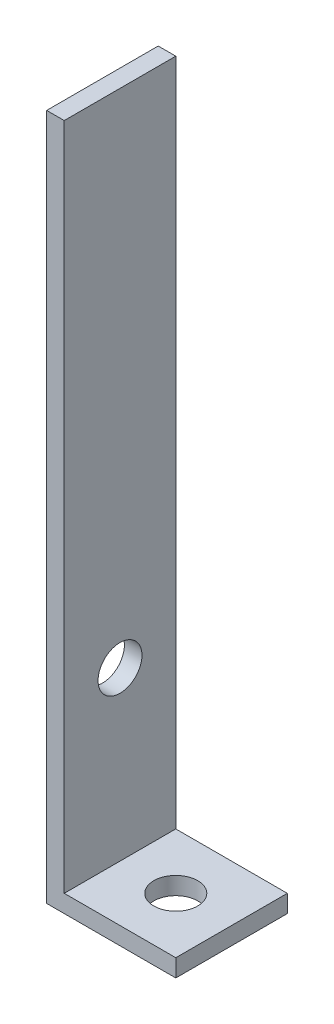
ISO-10303-21;
HEADER;
FILE_DESCRIPTION(('STEP AP214'),'2;1');
FILE_NAME('part.step','',(''),(''),'','','');
FILE_SCHEMA(('AUTOMOTIVE_DESIGN { 1 0 10303 214 1 1 1 1 }'));
ENDSEC;
DATA;
#1=APPLICATION_CONTEXT('core data for automotive mechanical design processes');
#2=APPLICATION_PROTOCOL_DEFINITION('international standard','automotive_design',2000,#1);
#3=PRODUCT_CONTEXT('',#1,'mechanical');
#4=PRODUCT('Part','Part','',(#3));
#5=PRODUCT_RELATED_PRODUCT_CATEGORY('part','',(#4));
#6=PRODUCT_DEFINITION_FORMATION('','',#4);
#7=PRODUCT_DEFINITION_CONTEXT('part definition',#1,'design');
#8=PRODUCT_DEFINITION('design','',#6,#7);
#9=PRODUCT_DEFINITION_SHAPE('','',#8);
#10=(LENGTH_UNIT() NAMED_UNIT(*) SI_UNIT(.MILLI.,.METRE.));
#11=(NAMED_UNIT(*) PLANE_ANGLE_UNIT() SI_UNIT($,.RADIAN.));
#12=(NAMED_UNIT(*) SI_UNIT($,.STERADIAN.) SOLID_ANGLE_UNIT());
#13=UNCERTAINTY_MEASURE_WITH_UNIT(LENGTH_MEASURE(1.E-05),#10,'distance_accuracy_value','');
#14=(GEOMETRIC_REPRESENTATION_CONTEXT(3) GLOBAL_UNCERTAINTY_ASSIGNED_CONTEXT((#13)) GLOBAL_UNIT_ASSIGNED_CONTEXT((#10,
#11,#12)) REPRESENTATION_CONTEXT('',''));
#15=CARTESIAN_POINT('',(0.,0.,0.));
#16=DIRECTION('',(0.,0.,1.));
#17=DIRECTION('',(1.,0.,0.));
#18=AXIS2_PLACEMENT_3D('',#15,#16,#17);
#19=CARTESIAN_POINT('',(0.,0.,12.7));
#20=DIRECTION('',(0.,1.,0.));
#21=DIRECTION('',(0.,0.,1.));
#22=AXIS2_PLACEMENT_3D('',#19,#20,#21);
#23=PLANE('',#22);
#24=CARTESIAN_POINT('',(8.35,0.,6.35));
#25=DIRECTION('',(0.,1.,0.));
#26=DIRECTION('',(0.,0.,1.));
#27=AXIS2_PLACEMENT_3D('',#24,#25,#26);
#28=CIRCLE('',#27,2.5);
#29=CARTESIAN_POINT('',(8.35,0.,8.85));
#30=VERTEX_POINT('',#29);
#31=EDGE_CURVE('E131',#30,#30,#28,.T.);
#32=ORIENTED_EDGE('',*,*,#31,.T.);
#33=EDGE_LOOP('',(#32));
#34=FACE_BOUND('',#33,.T.);
#35=DIRECTION('',(1.,0.,0.));
#36=VECTOR('',#35,1.);
#37=CARTESIAN_POINT('',(0.,0.,0.));
#38=LINE('',#37,#36);
#39=CARTESIAN_POINT('',(0.,0.,0.));
#40=VERTEX_POINT('',#39);
#41=CARTESIAN_POINT('',(14.7,0.,0.));
#42=VERTEX_POINT('',#41);
#43=EDGE_CURVE('E82',#40,#42,#38,.T.);
#44=ORIENTED_EDGE('',*,*,#43,.T.);
#45=DIRECTION('',(0.,0.,-1.));
#46=VECTOR('',#45,1.);
#47=CARTESIAN_POINT('',(14.7,0.,12.7));
#48=LINE('',#47,#46);
#49=CARTESIAN_POINT('',(14.7,0.,12.7));
#50=VERTEX_POINT('',#49);
#51=EDGE_CURVE('E44',#50,#42,#48,.T.);
#52=ORIENTED_EDGE('',*,*,#51,.F.);
#53=DIRECTION('',(1.,0.,0.));
#54=VECTOR('',#53,1.);
#55=CARTESIAN_POINT('',(0.,0.,12.7));
#56=LINE('',#55,#54);
#57=CARTESIAN_POINT('',(0.,0.,12.7));
#58=VERTEX_POINT('',#57);
#59=EDGE_CURVE('E85',#58,#50,#56,.T.);
#60=ORIENTED_EDGE('',*,*,#59,.F.);
#61=DIRECTION('',(0.,0.,-1.));
#62=VECTOR('',#61,1.);
#63=CARTESIAN_POINT('',(0.,0.,12.7));
#64=LINE('',#63,#62);
#65=EDGE_CURVE('E112',#58,#40,#64,.T.);
#66=ORIENTED_EDGE('',*,*,#65,.T.);
#67=EDGE_LOOP('',(#44,#52,#60,#66));
#68=FACE_BOUND('',#67,.T.);
#69=ADVANCED_FACE('F34',(#34,#68),#23,.F.);
#70=CARTESIAN_POINT('',(14.7,0.,12.7));
#71=DIRECTION('',(-1.,0.,0.));
#72=DIRECTION('',(0.,0.,1.));
#73=AXIS2_PLACEMENT_3D('',#70,#71,#72);
#74=PLANE('',#73);
#75=DIRECTION('',(0.,1.,0.));
#76=VECTOR('',#75,1.);
#77=CARTESIAN_POINT('',(14.7,0.,0.));
#78=LINE('',#77,#76);
#79=CARTESIAN_POINT('',(14.7,2.,0.));
#80=VERTEX_POINT('',#79);
#81=EDGE_CURVE('E117',#42,#80,#78,.T.);
#82=ORIENTED_EDGE('',*,*,#81,.T.);
#83=DIRECTION('',(0.,0.,-1.));
#84=VECTOR('',#83,1.);
#85=CARTESIAN_POINT('',(14.7,2.,12.7));
#86=LINE('',#85,#84);
#87=CARTESIAN_POINT('',(14.7,2.,12.7));
#88=VERTEX_POINT('',#87);
#89=EDGE_CURVE('E109',#88,#80,#86,.T.);
#90=ORIENTED_EDGE('',*,*,#89,.F.);
#91=DIRECTION('',(0.,1.,0.));
#92=VECTOR('',#91,1.);
#93=CARTESIAN_POINT('',(14.7,0.,12.7));
#94=LINE('',#93,#92);
#95=EDGE_CURVE('E124',#50,#88,#94,.T.);
#96=ORIENTED_EDGE('',*,*,#95,.F.);
#97=ORIENTED_EDGE('',*,*,#51,.T.);
#98=EDGE_LOOP('',(#82,#90,#96,#97));
#99=FACE_BOUND('',#98,.T.);
#100=ADVANCED_FACE('F142',(#99),#74,.F.);
#101=CARTESIAN_POINT('',(0.,2.,12.7));
#102=DIRECTION('',(0.,1.,0.));
#103=DIRECTION('',(0.,0.,1.));
#104=AXIS2_PLACEMENT_3D('',#101,#102,#103);
#105=PLANE('',#104);
#106=CARTESIAN_POINT('',(8.35,2.,6.35));
#107=DIRECTION('',(0.,1.,0.));
#108=DIRECTION('',(0.,0.,1.));
#109=AXIS2_PLACEMENT_3D('',#106,#107,#108);
#110=CIRCLE('',#109,2.49999999999999);
#111=CARTESIAN_POINT('',(8.35,2.,8.84999999999999));
#112=VERTEX_POINT('',#111);
#113=EDGE_CURVE('E134',#112,#112,#110,.T.);
#114=ORIENTED_EDGE('',*,*,#113,.F.);
#115=EDGE_LOOP('',(#114));
#116=FACE_BOUND('',#115,.T.);
#117=DIRECTION('',(0.,0.,-1.));
#118=VECTOR('',#117,1.);
#119=CARTESIAN_POINT('',(2.,2.,12.7));
#120=LINE('',#119,#118);
#121=CARTESIAN_POINT('',(2.,2.,12.7));
#122=VERTEX_POINT('',#121);
#123=CARTESIAN_POINT('',(2.,2.,0.));
#124=VERTEX_POINT('',#123);
#125=EDGE_CURVE('E11',#122,#124,#120,.T.);
#126=ORIENTED_EDGE('',*,*,#125,.F.);
#127=DIRECTION('',(1.,0.,0.));
#128=VECTOR('',#127,1.);
#129=CARTESIAN_POINT('',(0.,2.,12.7));
#130=LINE('',#129,#128);
#131=EDGE_CURVE('E122',#122,#88,#130,.T.);
#132=ORIENTED_EDGE('',*,*,#131,.T.);
#133=ORIENTED_EDGE('',*,*,#89,.T.);
#134=DIRECTION('',(1.,0.,0.));
#135=VECTOR('',#134,1.);
#136=CARTESIAN_POINT('',(0.,2.,0.));
#137=LINE('',#136,#135);
#138=EDGE_CURVE('E86',#124,#80,#137,.T.);
#139=ORIENTED_EDGE('',*,*,#138,.F.);
#140=EDGE_LOOP('',(#126,#132,#133,#139));
#141=FACE_BOUND('',#140,.T.);
#142=ADVANCED_FACE('F140',(#116,#141),#105,.T.);
#143=CARTESIAN_POINT('',(0.,0.,12.7));
#144=DIRECTION('',(-1.,0.,0.));
#145=DIRECTION('',(0.,0.,1.));
#146=AXIS2_PLACEMENT_3D('',#143,#144,#145);
#147=PLANE('',#146);
#148=CARTESIAN_POINT('',(0.,21.05,6.35));
#149=DIRECTION('',(1.,0.,0.));
#150=DIRECTION('',(0.,0.,-1.));
#151=AXIS2_PLACEMENT_3D('',#148,#149,#150);
#152=CIRCLE('',#151,2.5);
#153=CARTESIAN_POINT('',(0.,21.05,3.85));
#154=VERTEX_POINT('',#153);
#155=EDGE_CURVE('E96',#154,#154,#152,.T.);
#156=ORIENTED_EDGE('',*,*,#155,.T.);
#157=EDGE_LOOP('',(#156));
#158=FACE_BOUND('',#157,.T.);
#159=DIRECTION('',(0.,1.,0.));
#160=VECTOR('',#159,1.);
#161=CARTESIAN_POINT('',(0.,0.,0.));
#162=LINE('',#161,#160);
#163=CARTESIAN_POINT('',(0.,78.2,0.));
#164=VERTEX_POINT('',#163);
#165=EDGE_CURVE('E74',#40,#164,#162,.T.);
#166=ORIENTED_EDGE('',*,*,#165,.F.);
#167=ORIENTED_EDGE('',*,*,#65,.F.);
#168=DIRECTION('',(0.,1.,0.));
#169=VECTOR('',#168,1.);
#170=CARTESIAN_POINT('',(0.,0.,12.7));
#171=LINE('',#170,#169);
#172=CARTESIAN_POINT('',(0.,78.2,12.7));
#173=VERTEX_POINT('',#172);
#174=EDGE_CURVE('E92',#58,#173,#171,.T.);
#175=ORIENTED_EDGE('',*,*,#174,.T.);
#176=DIRECTION('',(0.,0.,-1.));
#177=VECTOR('',#176,1.);
#178=CARTESIAN_POINT('',(0.,78.2,12.7));
#179=LINE('',#178,#177);
#180=EDGE_CURVE('E89',#173,#164,#179,.T.);
#181=ORIENTED_EDGE('',*,*,#180,.T.);
#182=EDGE_LOOP('',(#166,#167,#175,#181));
#183=FACE_BOUND('',#182,.T.);
#184=ADVANCED_FACE('F90',(#158,#183),#147,.T.);
#185=CARTESIAN_POINT('',(0.,0.,12.7));
#186=DIRECTION('',(0.,0.,1.));
#187=DIRECTION('',(1.,0.,0.));
#188=AXIS2_PLACEMENT_3D('',#185,#186,#187);
#189=PLANE('',#188);
#190=ORIENTED_EDGE('',*,*,#59,.T.);
#191=ORIENTED_EDGE('',*,*,#95,.T.);
#192=ORIENTED_EDGE('',*,*,#131,.F.);
#193=DIRECTION('',(0.,1.,0.));
#194=VECTOR('',#193,1.);
#195=CARTESIAN_POINT('',(2.,2.,12.7));
#196=LINE('',#195,#194);
#197=CARTESIAN_POINT('',(1.99999999999999,78.2,12.7));
#198=VERTEX_POINT('',#197);
#199=EDGE_CURVE('E104',#122,#198,#196,.T.);
#200=ORIENTED_EDGE('',*,*,#199,.T.);
#201=DIRECTION('',(1.,0.,0.));
#202=VECTOR('',#201,1.);
#203=CARTESIAN_POINT('',(0.,78.2,12.7));
#204=LINE('',#203,#202);
#205=EDGE_CURVE('E98',#173,#198,#204,.T.);
#206=ORIENTED_EDGE('',*,*,#205,.F.);
#207=ORIENTED_EDGE('',*,*,#174,.F.);
#208=EDGE_LOOP('',(#190,#191,#192,#200,#206,#207));
#209=FACE_BOUND('',#208,.T.);
#210=ADVANCED_FACE('F148',(#209),#189,.T.);
#211=CARTESIAN_POINT('',(0.,0.,0.));
#212=DIRECTION('',(0.,0.,1.));
#213=DIRECTION('',(1.,0.,0.));
#214=AXIS2_PLACEMENT_3D('',#211,#212,#213);
#215=PLANE('',#214);
#216=ORIENTED_EDGE('',*,*,#43,.F.);
#217=ORIENTED_EDGE('',*,*,#165,.T.);
#218=DIRECTION('',(1.,0.,0.));
#219=VECTOR('',#218,1.);
#220=CARTESIAN_POINT('',(0.,78.2,0.));
#221=LINE('',#220,#219);
#222=CARTESIAN_POINT('',(1.99999999999999,78.2,0.));
#223=VERTEX_POINT('',#222);
#224=EDGE_CURVE('E78',#164,#223,#221,.T.);
#225=ORIENTED_EDGE('',*,*,#224,.T.);
#226=DIRECTION('',(0.,1.,0.));
#227=VECTOR('',#226,1.);
#228=CARTESIAN_POINT('',(2.,2.,0.));
#229=LINE('',#228,#227);
#230=EDGE_CURVE('E95',#124,#223,#229,.T.);
#231=ORIENTED_EDGE('',*,*,#230,.F.);
#232=ORIENTED_EDGE('',*,*,#138,.T.);
#233=ORIENTED_EDGE('',*,*,#81,.F.);
#234=EDGE_LOOP('',(#216,#217,#225,#231,#232,#233));
#235=FACE_BOUND('',#234,.T.);
#236=ADVANCED_FACE('F76',(#235),#215,.F.);
#237=CARTESIAN_POINT('',(0.,78.2,12.7));
#238=DIRECTION('',(0.,1.,0.));
#239=DIRECTION('',(0.,0.,1.));
#240=AXIS2_PLACEMENT_3D('',#237,#238,#239);
#241=PLANE('',#240);
#242=ORIENTED_EDGE('',*,*,#224,.F.);
#243=ORIENTED_EDGE('',*,*,#180,.F.);
#244=ORIENTED_EDGE('',*,*,#205,.T.);
#245=DIRECTION('',(0.,0.,-1.));
#246=VECTOR('',#245,1.);
#247=CARTESIAN_POINT('',(1.99999999999999,78.2,12.7));
#248=LINE('',#247,#246);
#249=EDGE_CURVE('E38',#198,#223,#248,.T.);
#250=ORIENTED_EDGE('',*,*,#249,.T.);
#251=EDGE_LOOP('',(#242,#243,#244,#250));
#252=FACE_BOUND('',#251,.T.);
#253=ADVANCED_FACE('F36',(#252),#241,.T.);
#254=CARTESIAN_POINT('',(2.,2.,12.7));
#255=DIRECTION('',(-1.,0.,0.));
#256=DIRECTION('',(0.,-1.,0.));
#257=AXIS2_PLACEMENT_3D('',#254,#255,#256);
#258=PLANE('',#257);
#259=CARTESIAN_POINT('',(2.,21.05,6.35));
#260=DIRECTION('',(1.,0.,0.));
#261=DIRECTION('',(0.,0.,-1.));
#262=AXIS2_PLACEMENT_3D('',#259,#260,#261);
#263=CIRCLE('',#262,2.49999999999999);
#264=CARTESIAN_POINT('',(2.,21.05,3.85000000000001));
#265=VERTEX_POINT('',#264);
#266=EDGE_CURVE('E101',#265,#265,#263,.T.);
#267=ORIENTED_EDGE('',*,*,#266,.F.);
#268=EDGE_LOOP('',(#267));
#269=FACE_BOUND('',#268,.T.);
#270=ORIENTED_EDGE('',*,*,#230,.T.);
#271=ORIENTED_EDGE('',*,*,#249,.F.);
#272=ORIENTED_EDGE('',*,*,#199,.F.);
#273=ORIENTED_EDGE('',*,*,#125,.T.);
#274=EDGE_LOOP('',(#270,#271,#272,#273));
#275=FACE_BOUND('',#274,.T.);
#276=ADVANCED_FACE('F154',(#269,#275),#258,.F.);
#277=CARTESIAN_POINT('',(2.,21.05,6.35));
#278=DIRECTION('',(1.,0.,0.));
#279=DIRECTION('',(0.,0.,-1.));
#280=AXIS2_PLACEMENT_3D('',#277,#278,#279);
#281=CYLINDRICAL_SURFACE('',#280,2.49999999999999);
#282=ORIENTED_EDGE('',*,*,#155,.F.);
#283=EDGE_LOOP('',(#282));
#284=FACE_BOUND('',#283,.T.);
#285=ORIENTED_EDGE('',*,*,#266,.T.);
#286=EDGE_LOOP('',(#285));
#287=FACE_BOUND('',#286,.T.);
#288=ADVANCED_FACE('F159',(#284,#287),#281,.F.);
#289=CARTESIAN_POINT('',(8.35,2.,6.35));
#290=DIRECTION('',(0.,1.,0.));
#291=DIRECTION('',(0.,0.,1.));
#292=AXIS2_PLACEMENT_3D('',#289,#290,#291);
#293=CYLINDRICAL_SURFACE('',#292,2.49999999999999);
#294=ORIENTED_EDGE('',*,*,#31,.F.);
#295=EDGE_LOOP('',(#294));
#296=FACE_BOUND('',#295,.T.);
#297=ORIENTED_EDGE('',*,*,#113,.T.);
#298=EDGE_LOOP('',(#297));
#299=FACE_BOUND('',#298,.T.);
#300=ADVANCED_FACE('F138',(#296,#299),#293,.F.);
#301=CLOSED_SHELL('',(#69,#100,#142,#184,#210,#236,#253,#276,#288,#300));
#302=MANIFOLD_SOLID_BREP('B2',#301);
#303=ADVANCED_BREP_SHAPE_REPRESENTATION('',(#18,#302),#14);
#304=SHAPE_DEFINITION_REPRESENTATION(#9,#303);
ENDSEC;
END-ISO-10303-21;
